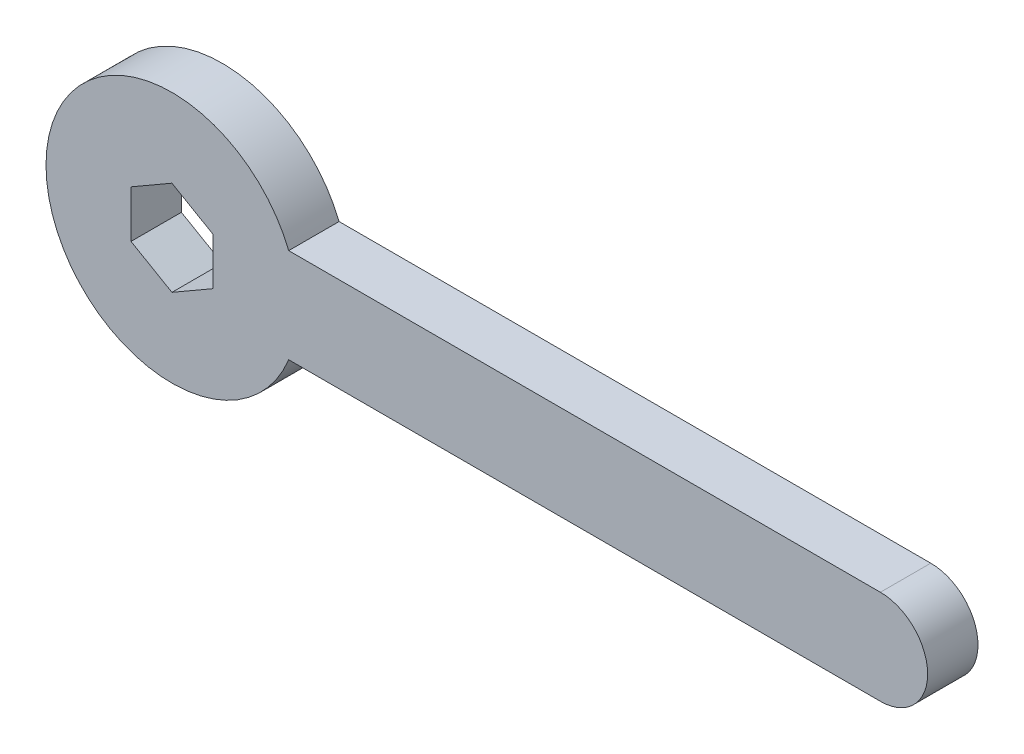
ISO-10303-21;
HEADER;
FILE_DESCRIPTION(('STEP AP214'),'2;1');
FILE_NAME('part.step','',(''),(''),'','','');
FILE_SCHEMA(('AUTOMOTIVE_DESIGN { 1 0 10303 214 1 1 1 1 }'));
ENDSEC;
DATA;
#1=APPLICATION_CONTEXT('core data for automotive mechanical design processes');
#2=APPLICATION_PROTOCOL_DEFINITION('international standard','automotive_design',2000,#1);
#3=PRODUCT_CONTEXT('',#1,'mechanical');
#4=PRODUCT('Part','Part','',(#3));
#5=PRODUCT_RELATED_PRODUCT_CATEGORY('part','',(#4));
#6=PRODUCT_DEFINITION_FORMATION('','',#4);
#7=PRODUCT_DEFINITION_CONTEXT('part definition',#1,'design');
#8=PRODUCT_DEFINITION('design','',#6,#7);
#9=PRODUCT_DEFINITION_SHAPE('','',#8);
#10=(LENGTH_UNIT() NAMED_UNIT(*) SI_UNIT(.MILLI.,.METRE.));
#11=(NAMED_UNIT(*) PLANE_ANGLE_UNIT() SI_UNIT($,.RADIAN.));
#12=(NAMED_UNIT(*) SI_UNIT($,.STERADIAN.) SOLID_ANGLE_UNIT());
#13=UNCERTAINTY_MEASURE_WITH_UNIT(LENGTH_MEASURE(1.E-05),#10,'distance_accuracy_value','');
#14=(GEOMETRIC_REPRESENTATION_CONTEXT(3) GLOBAL_UNCERTAINTY_ASSIGNED_CONTEXT((#13)) GLOBAL_UNIT_ASSIGNED_CONTEXT((#10,
#11,#12)) REPRESENTATION_CONTEXT('',''));
#15=CARTESIAN_POINT('',(0.,0.,0.));
#16=DIRECTION('',(0.,0.,1.));
#17=DIRECTION('',(1.,0.,0.));
#18=AXIS2_PLACEMENT_3D('',#15,#16,#17);
#19=CARTESIAN_POINT('',(0.,0.,8.));
#20=DIRECTION('',(0.,0.,1.));
#21=DIRECTION('',(1.,0.,0.));
#22=AXIS2_PLACEMENT_3D('',#19,#20,#21);
#23=PLANE('',#22);
#24=CARTESIAN_POINT('',(0.,0.,8.));
#25=DIRECTION('',(0.,0.,1.));
#26=DIRECTION('',(1.,0.,0.));
#27=AXIS2_PLACEMENT_3D('',#24,#25,#26);
#28=CIRCLE('',#27,20.);
#29=CARTESIAN_POINT('',(18.5404962177392,7.5,8.));
#30=VERTEX_POINT('',#29);
#31=CARTESIAN_POINT('',(18.5404962177392,-7.5,8.));
#32=VERTEX_POINT('',#31);
#33=EDGE_CURVE('E11',#30,#32,#28,.T.);
#34=ORIENTED_EDGE('',*,*,#33,.T.);
#35=DIRECTION('',(1.,0.,0.));
#36=VECTOR('',#35,1.);
#37=CARTESIAN_POINT('',(0.,-7.5,8.));
#38=LINE('',#37,#36);
#39=CARTESIAN_POINT('',(112.5,-7.5,8.));
#40=VERTEX_POINT('',#39);
#41=EDGE_CURVE('E200',#32,#40,#38,.T.);
#42=ORIENTED_EDGE('',*,*,#41,.T.);
#43=CARTESIAN_POINT('',(112.5,0.,8.));
#44=DIRECTION('',(0.,0.,1.));
#45=DIRECTION('',(1.,0.,0.));
#46=AXIS2_PLACEMENT_3D('',#43,#44,#45);
#47=CIRCLE('',#46,7.5);
#48=CARTESIAN_POINT('',(112.5,7.5,8.));
#49=VERTEX_POINT('',#48);
#50=EDGE_CURVE('E203',#40,#49,#47,.T.);
#51=ORIENTED_EDGE('',*,*,#50,.T.);
#52=DIRECTION('',(-1.,0.,0.));
#53=VECTOR('',#52,1.);
#54=CARTESIAN_POINT('',(112.5,7.5,8.));
#55=LINE('',#54,#53);
#56=EDGE_CURVE('E207',#49,#30,#55,.T.);
#57=ORIENTED_EDGE('',*,*,#56,.T.);
#58=EDGE_LOOP('',(#34,#42,#51,#57));
#59=FACE_BOUND('',#58,.T.);
#60=DIRECTION('',(-0.866025403784439,0.5,0.));
#61=VECTOR('',#60,1.);
#62=CARTESIAN_POINT('',(6.5,3.75277674973257,8.));
#63=LINE('',#62,#61);
#64=CARTESIAN_POINT('',(6.5,3.75277674973257,8.));
#65=VERTEX_POINT('',#64);
#66=CARTESIAN_POINT('',(0.,7.50555349946513,8.));
#67=VERTEX_POINT('',#66);
#68=EDGE_CURVE('E139',#65,#67,#63,.T.);
#69=ORIENTED_EDGE('',*,*,#68,.F.);
#70=DIRECTION('',(0.,1.,0.));
#71=VECTOR('',#70,1.);
#72=CARTESIAN_POINT('',(6.5,-3.75277674973256,8.));
#73=LINE('',#72,#71);
#74=CARTESIAN_POINT('',(6.5,-3.75277674973256,8.));
#75=VERTEX_POINT('',#74);
#76=EDGE_CURVE('E130',#75,#65,#73,.T.);
#77=ORIENTED_EDGE('',*,*,#76,.F.);
#78=DIRECTION('',(0.866025403784438,0.5,0.));
#79=VECTOR('',#78,1.);
#80=CARTESIAN_POINT('',(0.,-7.50555349946513,8.));
#81=LINE('',#80,#79);
#82=CARTESIAN_POINT('',(0.,-7.50555349946513,8.));
#83=VERTEX_POINT('',#82);
#84=EDGE_CURVE('E166',#83,#75,#81,.T.);
#85=ORIENTED_EDGE('',*,*,#84,.F.);
#86=DIRECTION('',(0.866025403784439,-0.5,0.));
#87=VECTOR('',#86,1.);
#88=CARTESIAN_POINT('',(-6.5,-3.75277674973256,8.));
#89=LINE('',#88,#87);
#90=CARTESIAN_POINT('',(-6.5,-3.75277674973256,8.));
#91=VERTEX_POINT('',#90);
#92=EDGE_CURVE('E163',#91,#83,#89,.T.);
#93=ORIENTED_EDGE('',*,*,#92,.F.);
#94=DIRECTION('',(0.,-1.,0.));
#95=VECTOR('',#94,1.);
#96=CARTESIAN_POINT('',(-6.5,3.75277674973257,8.));
#97=LINE('',#96,#95);
#98=CARTESIAN_POINT('',(-6.5,3.75277674973257,8.));
#99=VERTEX_POINT('',#98);
#100=EDGE_CURVE('E158',#99,#91,#97,.T.);
#101=ORIENTED_EDGE('',*,*,#100,.F.);
#102=DIRECTION('',(-0.866025403784439,-0.5,0.));
#103=VECTOR('',#102,1.);
#104=CARTESIAN_POINT('',(0.,7.50555349946513,8.));
#105=LINE('',#104,#103);
#106=EDGE_CURVE('E153',#67,#99,#105,.T.);
#107=ORIENTED_EDGE('',*,*,#106,.F.);
#108=EDGE_LOOP('',(#69,#77,#85,#93,#101,#107));
#109=FACE_BOUND('',#108,.T.);
#110=ADVANCED_FACE('F51',(#59,#109),#23,.T.);
#111=CARTESIAN_POINT('',(0.,0.,0.));
#112=DIRECTION('',(0.,0.,1.));
#113=DIRECTION('',(1.,0.,0.));
#114=AXIS2_PLACEMENT_3D('',#111,#112,#113);
#115=PLANE('',#114);
#116=CARTESIAN_POINT('',(0.,0.,0.));
#117=DIRECTION('',(0.,0.,1.));
#118=DIRECTION('',(1.,0.,0.));
#119=AXIS2_PLACEMENT_3D('',#116,#117,#118);
#120=CIRCLE('',#119,20.);
#121=CARTESIAN_POINT('',(18.5404962177392,7.5,0.));
#122=VERTEX_POINT('',#121);
#123=CARTESIAN_POINT('',(18.5404962177392,-7.5,0.));
#124=VERTEX_POINT('',#123);
#125=EDGE_CURVE('E56',#122,#124,#120,.T.);
#126=ORIENTED_EDGE('',*,*,#125,.F.);
#127=DIRECTION('',(-1.,0.,0.));
#128=VECTOR('',#127,1.);
#129=CARTESIAN_POINT('',(112.5,7.5,0.));
#130=LINE('',#129,#128);
#131=CARTESIAN_POINT('',(112.5,7.5,0.));
#132=VERTEX_POINT('',#131);
#133=EDGE_CURVE('E204',#132,#122,#130,.T.);
#134=ORIENTED_EDGE('',*,*,#133,.F.);
#135=CARTESIAN_POINT('',(112.5,0.,0.));
#136=DIRECTION('',(0.,0.,1.));
#137=DIRECTION('',(1.,0.,0.));
#138=AXIS2_PLACEMENT_3D('',#135,#136,#137);
#139=CIRCLE('',#138,7.5);
#140=CARTESIAN_POINT('',(112.5,-7.5,0.));
#141=VERTEX_POINT('',#140);
#142=EDGE_CURVE('E213',#141,#132,#139,.T.);
#143=ORIENTED_EDGE('',*,*,#142,.F.);
#144=DIRECTION('',(1.,0.,0.));
#145=VECTOR('',#144,1.);
#146=CARTESIAN_POINT('',(0.,-7.5,0.));
#147=LINE('',#146,#145);
#148=EDGE_CURVE('E148',#124,#141,#147,.T.);
#149=ORIENTED_EDGE('',*,*,#148,.F.);
#150=EDGE_LOOP('',(#126,#134,#143,#149));
#151=FACE_BOUND('',#150,.T.);
#152=DIRECTION('',(0.,1.,0.));
#153=VECTOR('',#152,1.);
#154=CARTESIAN_POINT('',(6.5,-3.75277674973256,0.));
#155=LINE('',#154,#153);
#156=CARTESIAN_POINT('',(6.5,-3.75277674973257,0.));
#157=VERTEX_POINT('',#156);
#158=CARTESIAN_POINT('',(6.5,3.75277674973257,0.));
#159=VERTEX_POINT('',#158);
#160=EDGE_CURVE('E76',#157,#159,#155,.T.);
#161=ORIENTED_EDGE('',*,*,#160,.T.);
#162=DIRECTION('',(-0.866025403784439,0.5,0.));
#163=VECTOR('',#162,1.);
#164=CARTESIAN_POINT('',(6.5,3.75277674973257,0.));
#165=LINE('',#164,#163);
#166=CARTESIAN_POINT('',(0.,7.50555349946513,0.));
#167=VERTEX_POINT('',#166);
#168=EDGE_CURVE('E146',#159,#167,#165,.T.);
#169=ORIENTED_EDGE('',*,*,#168,.T.);
#170=DIRECTION('',(-0.866025403784439,-0.5,0.));
#171=VECTOR('',#170,1.);
#172=CARTESIAN_POINT('',(0.,7.50555349946513,0.));
#173=LINE('',#172,#171);
#174=CARTESIAN_POINT('',(-6.5,3.75277674973257,0.));
#175=VERTEX_POINT('',#174);
#176=EDGE_CURVE('E173',#167,#175,#173,.T.);
#177=ORIENTED_EDGE('',*,*,#176,.T.);
#178=DIRECTION('',(0.,-1.,0.));
#179=VECTOR('',#178,1.);
#180=CARTESIAN_POINT('',(-6.5,3.75277674973257,0.));
#181=LINE('',#180,#179);
#182=CARTESIAN_POINT('',(-6.5,-3.75277674973256,0.));
#183=VERTEX_POINT('',#182);
#184=EDGE_CURVE('E177',#175,#183,#181,.T.);
#185=ORIENTED_EDGE('',*,*,#184,.T.);
#186=DIRECTION('',(0.866025403784439,-0.5,0.));
#187=VECTOR('',#186,1.);
#188=CARTESIAN_POINT('',(-6.5,-3.75277674973256,0.));
#189=LINE('',#188,#187);
#190=CARTESIAN_POINT('',(0.,-7.50555349946513,0.));
#191=VERTEX_POINT('',#190);
#192=EDGE_CURVE('E181',#183,#191,#189,.T.);
#193=ORIENTED_EDGE('',*,*,#192,.T.);
#194=DIRECTION('',(0.866025403784438,0.5,0.));
#195=VECTOR('',#194,1.);
#196=CARTESIAN_POINT('',(0.,-7.50555349946513,0.));
#197=LINE('',#196,#195);
#198=EDGE_CURVE('E140',#191,#157,#197,.T.);
#199=ORIENTED_EDGE('',*,*,#198,.T.);
#200=EDGE_LOOP('',(#161,#169,#177,#185,#193,#199));
#201=FACE_BOUND('',#200,.T.);
#202=ADVANCED_FACE('F241',(#151,#201),#115,.F.);
#203=CARTESIAN_POINT('',(0.,0.,8.));
#204=DIRECTION('',(0.,0.,-1.));
#205=DIRECTION('',(-1.,0.,0.));
#206=AXIS2_PLACEMENT_3D('',#203,#204,#205);
#207=CYLINDRICAL_SURFACE('',#206,20.);
#208=DIRECTION('',(0.,0.,-1.));
#209=VECTOR('',#208,1.);
#210=CARTESIAN_POINT('',(18.5404962177392,-7.5,8.));
#211=LINE('',#210,#209);
#212=EDGE_CURVE('E230',#32,#124,#211,.T.);
#213=ORIENTED_EDGE('',*,*,#212,.F.);
#214=ORIENTED_EDGE('',*,*,#33,.F.);
#215=DIRECTION('',(0.,0.,-1.));
#216=VECTOR('',#215,1.);
#217=CARTESIAN_POINT('',(18.5404962177392,7.5,8.));
#218=LINE('',#217,#216);
#219=EDGE_CURVE('E226',#122,#30,#218,.F.);
#220=ORIENTED_EDGE('',*,*,#219,.F.);
#221=ORIENTED_EDGE('',*,*,#125,.T.);
#222=EDGE_LOOP('',(#213,#214,#220,#221));
#223=FACE_BOUND('',#222,.T.);
#224=ADVANCED_FACE('F54',(#223),#207,.T.);
#225=CARTESIAN_POINT('',(0.,-7.5,8.));
#226=DIRECTION('',(0.,1.,0.));
#227=DIRECTION('',(0.,0.,1.));
#228=AXIS2_PLACEMENT_3D('',#225,#226,#227);
#229=PLANE('',#228);
#230=ORIENTED_EDGE('',*,*,#41,.F.);
#231=ORIENTED_EDGE('',*,*,#212,.T.);
#232=ORIENTED_EDGE('',*,*,#148,.T.);
#233=DIRECTION('',(0.,0.,-1.));
#234=VECTOR('',#233,1.);
#235=CARTESIAN_POINT('',(112.5,-7.5,8.));
#236=LINE('',#235,#234);
#237=EDGE_CURVE('E222',#40,#141,#236,.T.);
#238=ORIENTED_EDGE('',*,*,#237,.F.);
#239=EDGE_LOOP('',(#230,#231,#232,#238));
#240=FACE_BOUND('',#239,.T.);
#241=ADVANCED_FACE('F245',(#240),#229,.F.);
#242=CARTESIAN_POINT('',(112.5,7.5,8.));
#243=DIRECTION('',(0.,-1.,0.));
#244=DIRECTION('',(0.,0.,-1.));
#245=AXIS2_PLACEMENT_3D('',#242,#243,#244);
#246=PLANE('',#245);
#247=ORIENTED_EDGE('',*,*,#133,.T.);
#248=ORIENTED_EDGE('',*,*,#219,.T.);
#249=ORIENTED_EDGE('',*,*,#56,.F.);
#250=DIRECTION('',(0.,0.,-1.));
#251=VECTOR('',#250,1.);
#252=CARTESIAN_POINT('',(112.5,7.5,8.));
#253=LINE('',#252,#251);
#254=EDGE_CURVE('E211',#49,#132,#253,.T.);
#255=ORIENTED_EDGE('',*,*,#254,.T.);
#256=EDGE_LOOP('',(#247,#248,#249,#255));
#257=FACE_BOUND('',#256,.T.);
#258=ADVANCED_FACE('F253',(#257),#246,.F.);
#259=CARTESIAN_POINT('',(112.5,0.,8.));
#260=DIRECTION('',(0.,0.,-1.));
#261=DIRECTION('',(-1.,0.,0.));
#262=AXIS2_PLACEMENT_3D('',#259,#260,#261);
#263=CYLINDRICAL_SURFACE('',#262,7.5);
#264=ORIENTED_EDGE('',*,*,#142,.T.);
#265=ORIENTED_EDGE('',*,*,#254,.F.);
#266=ORIENTED_EDGE('',*,*,#50,.F.);
#267=ORIENTED_EDGE('',*,*,#237,.T.);
#268=EDGE_LOOP('',(#264,#265,#266,#267));
#269=FACE_BOUND('',#268,.T.);
#270=ADVANCED_FACE('F248',(#269),#263,.T.);
#271=CARTESIAN_POINT('',(6.5,-3.75277674973256,8.));
#272=DIRECTION('',(-1.,0.,0.));
#273=DIRECTION('',(0.,-1.,0.));
#274=AXIS2_PLACEMENT_3D('',#271,#272,#273);
#275=PLANE('',#274);
#276=ORIENTED_EDGE('',*,*,#160,.F.);
#277=DIRECTION('',(0.,0.,-1.));
#278=VECTOR('',#277,1.);
#279=CARTESIAN_POINT('',(6.5,-3.75277674973256,8.));
#280=LINE('',#279,#278);
#281=EDGE_CURVE('E134',#75,#157,#280,.T.);
#282=ORIENTED_EDGE('',*,*,#281,.F.);
#283=ORIENTED_EDGE('',*,*,#76,.T.);
#284=DIRECTION('',(0.,0.,-1.));
#285=VECTOR('',#284,1.);
#286=CARTESIAN_POINT('',(6.5,3.75277674973257,8.));
#287=LINE('',#286,#285);
#288=EDGE_CURVE('E133',#65,#159,#287,.T.);
#289=ORIENTED_EDGE('',*,*,#288,.T.);
#290=EDGE_LOOP('',(#276,#282,#283,#289));
#291=FACE_BOUND('',#290,.T.);
#292=ADVANCED_FACE('F132',(#291),#275,.T.);
#293=CARTESIAN_POINT('',(6.5,3.75277674973257,8.));
#294=DIRECTION('',(-0.5,-0.866025403784439,0.));
#295=DIRECTION('',(0.866025403784439,-0.5,0.));
#296=AXIS2_PLACEMENT_3D('',#293,#294,#295);
#297=PLANE('',#296);
#298=ORIENTED_EDGE('',*,*,#168,.F.);
#299=ORIENTED_EDGE('',*,*,#288,.F.);
#300=ORIENTED_EDGE('',*,*,#68,.T.);
#301=DIRECTION('',(0.,0.,-1.));
#302=VECTOR('',#301,1.);
#303=CARTESIAN_POINT('',(0.,7.50555349946513,8.));
#304=LINE('',#303,#302);
#305=EDGE_CURVE('E149',#67,#167,#304,.T.);
#306=ORIENTED_EDGE('',*,*,#305,.T.);
#307=EDGE_LOOP('',(#298,#299,#300,#306));
#308=FACE_BOUND('',#307,.T.);
#309=ADVANCED_FACE('F143',(#308),#297,.T.);
#310=CARTESIAN_POINT('',(0.,7.50555349946513,8.));
#311=DIRECTION('',(0.5,-0.866025403784439,0.));
#312=DIRECTION('',(0.866025403784439,0.5,0.));
#313=AXIS2_PLACEMENT_3D('',#310,#311,#312);
#314=PLANE('',#313);
#315=ORIENTED_EDGE('',*,*,#176,.F.);
#316=ORIENTED_EDGE('',*,*,#305,.F.);
#317=ORIENTED_EDGE('',*,*,#106,.T.);
#318=DIRECTION('',(0.,0.,-1.));
#319=VECTOR('',#318,1.);
#320=CARTESIAN_POINT('',(-6.5,3.75277674973257,8.));
#321=LINE('',#320,#319);
#322=EDGE_CURVE('E195',#99,#175,#321,.T.);
#323=ORIENTED_EDGE('',*,*,#322,.T.);
#324=EDGE_LOOP('',(#315,#316,#317,#323));
#325=FACE_BOUND('',#324,.T.);
#326=ADVANCED_FACE('F276',(#325),#314,.T.);
#327=CARTESIAN_POINT('',(-6.5,3.75277674973257,8.));
#328=DIRECTION('',(1.,0.,0.));
#329=DIRECTION('',(0.,1.,0.));
#330=AXIS2_PLACEMENT_3D('',#327,#328,#329);
#331=PLANE('',#330);
#332=ORIENTED_EDGE('',*,*,#184,.F.);
#333=ORIENTED_EDGE('',*,*,#322,.F.);
#334=ORIENTED_EDGE('',*,*,#100,.T.);
#335=DIRECTION('',(0.,0.,-1.));
#336=VECTOR('',#335,1.);
#337=CARTESIAN_POINT('',(-6.5,-3.75277674973256,8.));
#338=LINE('',#337,#336);
#339=EDGE_CURVE('E192',#91,#183,#338,.T.);
#340=ORIENTED_EDGE('',*,*,#339,.T.);
#341=EDGE_LOOP('',(#332,#333,#334,#340));
#342=FACE_BOUND('',#341,.T.);
#343=ADVANCED_FACE('F279',(#342),#331,.T.);
#344=CARTESIAN_POINT('',(-6.5,-3.75277674973256,8.));
#345=DIRECTION('',(0.5,0.866025403784439,0.));
#346=DIRECTION('',(-0.866025403784439,0.5,0.));
#347=AXIS2_PLACEMENT_3D('',#344,#345,#346);
#348=PLANE('',#347);
#349=ORIENTED_EDGE('',*,*,#192,.F.);
#350=ORIENTED_EDGE('',*,*,#339,.F.);
#351=ORIENTED_EDGE('',*,*,#92,.T.);
#352=DIRECTION('',(0.,0.,-1.));
#353=VECTOR('',#352,1.);
#354=CARTESIAN_POINT('',(0.,-7.50555349946513,8.));
#355=LINE('',#354,#353);
#356=EDGE_CURVE('E68',#83,#191,#355,.T.);
#357=ORIENTED_EDGE('',*,*,#356,.T.);
#358=EDGE_LOOP('',(#349,#350,#351,#357));
#359=FACE_BOUND('',#358,.T.);
#360=ADVANCED_FACE('F282',(#359),#348,.T.);
#361=CARTESIAN_POINT('',(0.,-7.50555349946513,8.));
#362=DIRECTION('',(-0.5,0.866025403784439,0.));
#363=DIRECTION('',(-0.866025403784439,-0.5,0.));
#364=AXIS2_PLACEMENT_3D('',#361,#362,#363);
#365=PLANE('',#364);
#366=ORIENTED_EDGE('',*,*,#198,.F.);
#367=ORIENTED_EDGE('',*,*,#356,.F.);
#368=ORIENTED_EDGE('',*,*,#84,.T.);
#369=ORIENTED_EDGE('',*,*,#281,.T.);
#370=EDGE_LOOP('',(#366,#367,#368,#369));
#371=FACE_BOUND('',#370,.T.);
#372=ADVANCED_FACE('F284',(#371),#365,.T.);
#373=CLOSED_SHELL('',(#110,#202,#224,#241,#258,#270,#292,#309,#326,#343,#360,#372));
#374=MANIFOLD_SOLID_BREP('B2',#373);
#375=ADVANCED_BREP_SHAPE_REPRESENTATION('',(#18,#374),#14);
#376=SHAPE_DEFINITION_REPRESENTATION(#9,#375);
ENDSEC;
END-ISO-10303-21;
